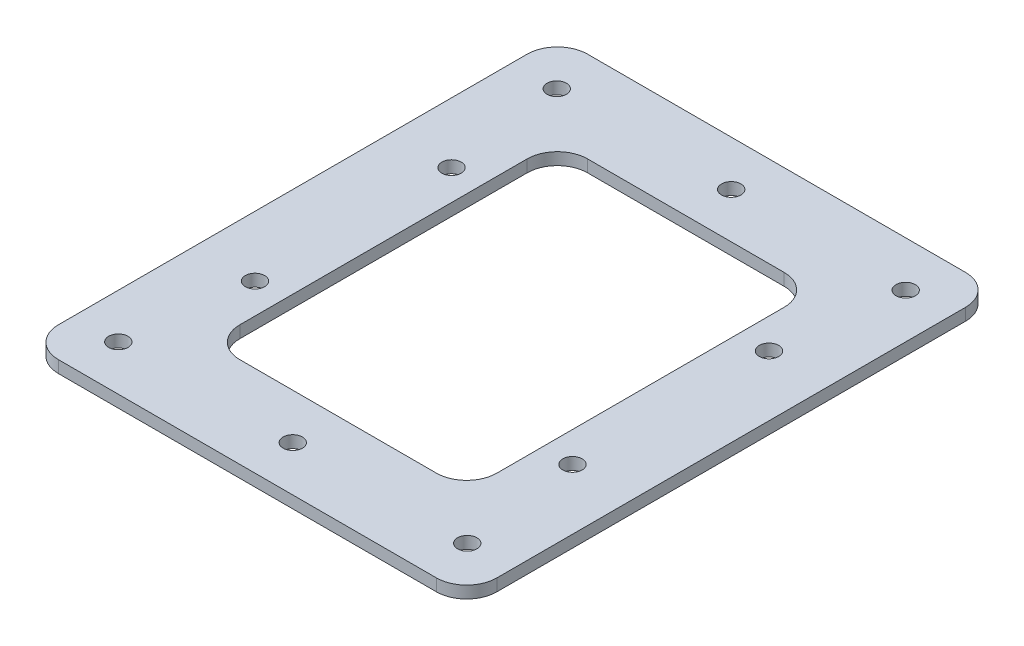
ISO-10303-21;
HEADER;
FILE_DESCRIPTION(('STEP AP214'),'2;1');
FILE_NAME('part.step','',(''),(''),'','','');
FILE_SCHEMA(('AUTOMOTIVE_DESIGN { 1 0 10303 214 1 1 1 1 }'));
ENDSEC;
DATA;
#1=APPLICATION_CONTEXT('core data for automotive mechanical design processes');
#2=APPLICATION_PROTOCOL_DEFINITION('international standard','automotive_design',2000,#1);
#3=PRODUCT_CONTEXT('',#1,'mechanical');
#4=PRODUCT('Part','Part','',(#3));
#5=PRODUCT_RELATED_PRODUCT_CATEGORY('part','',(#4));
#6=PRODUCT_DEFINITION_FORMATION('','',#4);
#7=PRODUCT_DEFINITION_CONTEXT('part definition',#1,'design');
#8=PRODUCT_DEFINITION('design','',#6,#7);
#9=PRODUCT_DEFINITION_SHAPE('','',#8);
#10=(LENGTH_UNIT() NAMED_UNIT(*) SI_UNIT(.MILLI.,.METRE.));
#11=(NAMED_UNIT(*) PLANE_ANGLE_UNIT() SI_UNIT($,.RADIAN.));
#12=(NAMED_UNIT(*) SI_UNIT($,.STERADIAN.) SOLID_ANGLE_UNIT());
#13=UNCERTAINTY_MEASURE_WITH_UNIT(LENGTH_MEASURE(1.E-05),#10,'distance_accuracy_value','');
#14=(GEOMETRIC_REPRESENTATION_CONTEXT(3) GLOBAL_UNCERTAINTY_ASSIGNED_CONTEXT((#13)) GLOBAL_UNIT_ASSIGNED_CONTEXT((#10,
#11,#12)) REPRESENTATION_CONTEXT('',''));
#15=CARTESIAN_POINT('',(0.,0.,0.));
#16=DIRECTION('',(0.,0.,1.));
#17=DIRECTION('',(1.,0.,0.));
#18=AXIS2_PLACEMENT_3D('',#15,#16,#17);
#19=CARTESIAN_POINT('',(0.,2.,0.));
#20=DIRECTION('',(0.,1.,0.));
#21=DIRECTION('',(0.,0.,1.));
#22=AXIS2_PLACEMENT_3D('',#19,#20,#21);
#23=PLANE('',#22);
#24=CARTESIAN_POINT('',(47.5,2.,-12.5));
#25=DIRECTION('',(0.,1.,0.));
#26=DIRECTION('',(0.,0.,-1.));
#27=AXIS2_PLACEMENT_3D('',#24,#25,#26);
#28=CIRCLE('',#27,1.6);
#29=CARTESIAN_POINT('',(47.5,2.,-14.1));
#30=VERTEX_POINT('',#29);
#31=EDGE_CURVE('E685',#30,#30,#28,.T.);
#32=ORIENTED_EDGE('',*,*,#31,.F.);
#33=EDGE_LOOP('',(#32));
#34=FACE_BOUND('',#33,.T.);
#35=CARTESIAN_POINT('',(-5.,2.,-12.5));
#36=DIRECTION('',(0.,1.,0.));
#37=DIRECTION('',(0.,0.,1.));
#38=AXIS2_PLACEMENT_3D('',#35,#36,#37);
#39=CIRCLE('',#38,1.6);
#40=CARTESIAN_POINT('',(-5.,2.,-10.9));
#41=VERTEX_POINT('',#40);
#42=EDGE_CURVE('E669',#41,#41,#39,.T.);
#43=ORIENTED_EDGE('',*,*,#42,.F.);
#44=EDGE_LOOP('',(#43));
#45=FACE_BOUND('',#44,.T.);
#46=CARTESIAN_POINT('',(21.25,2.,7.49999999999999));
#47=DIRECTION('',(0.,1.,0.));
#48=DIRECTION('',(0.,0.,1.));
#49=AXIS2_PLACEMENT_3D('',#46,#47,#48);
#50=CIRCLE('',#49,1.6);
#51=CARTESIAN_POINT('',(21.25,2.,9.1));
#52=VERTEX_POINT('',#51);
#53=EDGE_CURVE('E653',#52,#52,#50,.T.);
#54=ORIENTED_EDGE('',*,*,#53,.F.);
#55=EDGE_LOOP('',(#54));
#56=FACE_BOUND('',#55,.T.);
#57=CARTESIAN_POINT('',(50.1,2.,-65.));
#58=DIRECTION('',(0.,1.,0.));
#59=DIRECTION('',(0.,0.,1.));
#60=AXIS2_PLACEMENT_3D('',#57,#58,#59);
#61=CIRCLE('',#60,1.6);
#62=CARTESIAN_POINT('',(50.1,2.,-63.4));
#63=VERTEX_POINT('',#62);
#64=EDGE_CURVE('E637',#63,#63,#61,.T.);
#65=ORIENTED_EDGE('',*,*,#64,.F.);
#66=EDGE_LOOP('',(#65));
#67=FACE_BOUND('',#66,.T.);
#68=CARTESIAN_POINT('',(-7.6,2.,-65.));
#69=DIRECTION('',(0.,1.,0.));
#70=DIRECTION('',(0.,0.,1.));
#71=AXIS2_PLACEMENT_3D('',#68,#69,#70);
#72=CIRCLE('',#71,1.6);
#73=CARTESIAN_POINT('',(-7.6,2.,-63.4));
#74=VERTEX_POINT('',#73);
#75=EDGE_CURVE('E298',#74,#74,#72,.T.);
#76=ORIENTED_EDGE('',*,*,#75,.F.);
#77=EDGE_LOOP('',(#76));
#78=FACE_BOUND('',#77,.T.);
#79=DIRECTION('',(0.,0.,1.));
#80=VECTOR('',#79,1.);
#81=CARTESIAN_POINT('',(-15.,2.,15.));
#82=LINE('',#81,#80);
#83=CARTESIAN_POINT('',(-15.,2.,-67.5));
#84=VERTEX_POINT('',#83);
#85=CARTESIAN_POINT('',(-15.,2.,10.));
#86=VERTEX_POINT('',#85);
#87=EDGE_CURVE('E190',#84,#86,#82,.T.);
#88=ORIENTED_EDGE('',*,*,#87,.T.);
#89=CARTESIAN_POINT('',(-10.,2.,10.));
#90=DIRECTION('',(0.,1.,0.));
#91=DIRECTION('',(0.,0.,1.));
#92=AXIS2_PLACEMENT_3D('',#89,#90,#91);
#93=CIRCLE('',#92,5.);
#94=CARTESIAN_POINT('',(-10.,2.,15.));
#95=VERTEX_POINT('',#94);
#96=EDGE_CURVE('E256',#86,#95,#93,.T.);
#97=ORIENTED_EDGE('',*,*,#96,.T.);
#98=DIRECTION('',(1.,0.,0.));
#99=VECTOR('',#98,1.);
#100=CARTESIAN_POINT('',(-15.,2.,15.));
#101=LINE('',#100,#99);
#102=CARTESIAN_POINT('',(52.5,2.,15.));
#103=VERTEX_POINT('',#102);
#104=EDGE_CURVE('E330',#95,#103,#101,.T.);
#105=ORIENTED_EDGE('',*,*,#104,.T.);
#106=CARTESIAN_POINT('',(52.5,2.,10.));
#107=DIRECTION('',(0.,1.,0.));
#108=DIRECTION('',(0.,0.,1.));
#109=AXIS2_PLACEMENT_3D('',#106,#107,#108);
#110=CIRCLE('',#109,5.);
#111=CARTESIAN_POINT('',(57.5,2.,10.));
#112=VERTEX_POINT('',#111);
#113=EDGE_CURVE('E253',#103,#112,#110,.T.);
#114=ORIENTED_EDGE('',*,*,#113,.T.);
#115=DIRECTION('',(0.,0.,-1.));
#116=VECTOR('',#115,1.);
#117=CARTESIAN_POINT('',(57.5,2.,15.));
#118=LINE('',#117,#116);
#119=CARTESIAN_POINT('',(57.5,2.,-67.5));
#120=VERTEX_POINT('',#119);
#121=EDGE_CURVE('E334',#112,#120,#118,.T.);
#122=ORIENTED_EDGE('',*,*,#121,.T.);
#123=CARTESIAN_POINT('',(52.5,2.,-67.5));
#124=DIRECTION('',(0.,1.,0.));
#125=DIRECTION('',(0.,0.,1.));
#126=AXIS2_PLACEMENT_3D('',#123,#124,#125);
#127=CIRCLE('',#126,5.);
#128=CARTESIAN_POINT('',(52.5,2.,-72.5));
#129=VERTEX_POINT('',#128);
#130=EDGE_CURVE('E68',#120,#129,#127,.T.);
#131=ORIENTED_EDGE('',*,*,#130,.T.);
#132=DIRECTION('',(-1.,0.,0.));
#133=VECTOR('',#132,1.);
#134=CARTESIAN_POINT('',(-15.,2.,-72.5));
#135=LINE('',#134,#133);
#136=CARTESIAN_POINT('',(-10.,2.,-72.5));
#137=VERTEX_POINT('',#136);
#138=EDGE_CURVE('E197',#129,#137,#135,.T.);
#139=ORIENTED_EDGE('',*,*,#138,.T.);
#140=CARTESIAN_POINT('',(-10.,2.,-67.5));
#141=DIRECTION('',(0.,1.,0.));
#142=DIRECTION('',(0.,0.,1.));
#143=AXIS2_PLACEMENT_3D('',#140,#141,#142);
#144=CIRCLE('',#143,5.);
#145=EDGE_CURVE('E248',#137,#84,#144,.T.);
#146=ORIENTED_EDGE('',*,*,#145,.T.);
#147=EDGE_LOOP('',(#88,#97,#105,#114,#122,#131,#139,#146));
#148=FACE_BOUND('',#147,.T.);
#149=DIRECTION('',(1.,0.,0.));
#150=VECTOR('',#149,1.);
#151=CARTESIAN_POINT('',(0.,2.,0.));
#152=LINE('',#151,#150);
#153=CARTESIAN_POINT('',(5.,2.,0.));
#154=VERTEX_POINT('',#153);
#155=CARTESIAN_POINT('',(37.5,2.,0.));
#156=VERTEX_POINT('',#155);
#157=EDGE_CURVE('E322',#154,#156,#152,.T.);
#158=ORIENTED_EDGE('',*,*,#157,.F.);
#159=CARTESIAN_POINT('',(5.,2.,-5.));
#160=DIRECTION('',(0.,1.,0.));
#161=DIRECTION('',(0.,0.,1.));
#162=AXIS2_PLACEMENT_3D('',#159,#160,#161);
#163=CIRCLE('',#162,5.);
#164=CARTESIAN_POINT('',(0.,2.,-5.));
#165=VERTEX_POINT('',#164);
#166=EDGE_CURVE('E282',#154,#165,#163,.F.);
#167=ORIENTED_EDGE('',*,*,#166,.T.);
#168=DIRECTION('',(0.,0.,1.));
#169=VECTOR('',#168,1.);
#170=CARTESIAN_POINT('',(0.,2.,0.));
#171=LINE('',#170,#169);
#172=CARTESIAN_POINT('',(0.,2.,-52.5));
#173=VERTEX_POINT('',#172);
#174=EDGE_CURVE('E309',#173,#165,#171,.T.);
#175=ORIENTED_EDGE('',*,*,#174,.F.);
#176=CARTESIAN_POINT('',(4.99999999999999,2.,-52.5));
#177=DIRECTION('',(0.,1.,0.));
#178=DIRECTION('',(0.,0.,1.));
#179=AXIS2_PLACEMENT_3D('',#176,#177,#178);
#180=CIRCLE('',#179,5.);
#181=CARTESIAN_POINT('',(4.99999999999999,2.,-57.5));
#182=VERTEX_POINT('',#181);
#183=EDGE_CURVE('E11',#173,#182,#180,.F.);
#184=ORIENTED_EDGE('',*,*,#183,.T.);
#185=DIRECTION('',(-1.,0.,0.));
#186=VECTOR('',#185,1.);
#187=CARTESIAN_POINT('',(0.,2.,-57.5));
#188=LINE('',#187,#186);
#189=CARTESIAN_POINT('',(37.5,2.,-57.5));
#190=VERTEX_POINT('',#189);
#191=EDGE_CURVE('E307',#190,#182,#188,.T.);
#192=ORIENTED_EDGE('',*,*,#191,.F.);
#193=CARTESIAN_POINT('',(37.5,2.,-52.5));
#194=DIRECTION('',(0.,1.,0.));
#195=DIRECTION('',(0.,0.,1.));
#196=AXIS2_PLACEMENT_3D('',#193,#194,#195);
#197=CIRCLE('',#196,5.);
#198=CARTESIAN_POINT('',(42.5,2.,-52.5));
#199=VERTEX_POINT('',#198);
#200=EDGE_CURVE('E174',#190,#199,#197,.F.);
#201=ORIENTED_EDGE('',*,*,#200,.T.);
#202=DIRECTION('',(0.,0.,-1.));
#203=VECTOR('',#202,1.);
#204=CARTESIAN_POINT('',(42.5,2.,0.));
#205=LINE('',#204,#203);
#206=CARTESIAN_POINT('',(42.5,2.,-5.));
#207=VERTEX_POINT('',#206);
#208=EDGE_CURVE('E315',#207,#199,#205,.T.);
#209=ORIENTED_EDGE('',*,*,#208,.F.);
#210=CARTESIAN_POINT('',(37.5,2.,-5.));
#211=DIRECTION('',(0.,1.,0.));
#212=DIRECTION('',(0.,0.,1.));
#213=AXIS2_PLACEMENT_3D('',#210,#211,#212);
#214=CIRCLE('',#213,5.);
#215=EDGE_CURVE('E173',#207,#156,#214,.F.);
#216=ORIENTED_EDGE('',*,*,#215,.T.);
#217=EDGE_LOOP('',(#158,#167,#175,#184,#192,#201,#209,#216));
#218=FACE_BOUND('',#217,.T.);
#219=CARTESIAN_POINT('',(21.25,2.,-65.));
#220=DIRECTION('',(0.,1.,0.));
#221=DIRECTION('',(0.,0.,1.));
#222=AXIS2_PLACEMENT_3D('',#219,#220,#221);
#223=CIRCLE('',#222,1.6);
#224=CARTESIAN_POINT('',(21.25,2.,-63.4));
#225=VERTEX_POINT('',#224);
#226=EDGE_CURVE('E629',#225,#225,#223,.T.);
#227=ORIENTED_EDGE('',*,*,#226,.F.);
#228=EDGE_LOOP('',(#227));
#229=FACE_BOUND('',#228,.T.);
#230=CARTESIAN_POINT('',(50.1,2.,7.5));
#231=DIRECTION('',(0.,1.,0.));
#232=DIRECTION('',(0.,0.,1.));
#233=AXIS2_PLACEMENT_3D('',#230,#231,#232);
#234=CIRCLE('',#233,1.6);
#235=CARTESIAN_POINT('',(50.1,2.,9.1));
#236=VERTEX_POINT('',#235);
#237=EDGE_CURVE('E645',#236,#236,#234,.T.);
#238=ORIENTED_EDGE('',*,*,#237,.F.);
#239=EDGE_LOOP('',(#238));
#240=FACE_BOUND('',#239,.T.);
#241=CARTESIAN_POINT('',(-7.6,2.,7.5));
#242=DIRECTION('',(0.,1.,0.));
#243=DIRECTION('',(0.,0.,1.));
#244=AXIS2_PLACEMENT_3D('',#241,#242,#243);
#245=CIRCLE('',#244,1.6);
#246=CARTESIAN_POINT('',(-7.6,2.,9.1));
#247=VERTEX_POINT('',#246);
#248=EDGE_CURVE('E661',#247,#247,#245,.T.);
#249=ORIENTED_EDGE('',*,*,#248,.F.);
#250=EDGE_LOOP('',(#249));
#251=FACE_BOUND('',#250,.T.);
#252=CARTESIAN_POINT('',(-5.,2.,-45.));
#253=DIRECTION('',(0.,1.,0.));
#254=DIRECTION('',(0.,0.,1.));
#255=AXIS2_PLACEMENT_3D('',#252,#253,#254);
#256=CIRCLE('',#255,1.59999999999999);
#257=CARTESIAN_POINT('',(-5.,2.,-43.4));
#258=VERTEX_POINT('',#257);
#259=EDGE_CURVE('E677',#258,#258,#256,.T.);
#260=ORIENTED_EDGE('',*,*,#259,.F.);
#261=EDGE_LOOP('',(#260));
#262=FACE_BOUND('',#261,.T.);
#263=CARTESIAN_POINT('',(47.5,2.,-45.));
#264=DIRECTION('',(0.,1.,0.));
#265=DIRECTION('',(0.,0.,-1.));
#266=AXIS2_PLACEMENT_3D('',#263,#264,#265);
#267=CIRCLE('',#266,1.59999999999999);
#268=CARTESIAN_POINT('',(47.5,2.,-46.6));
#269=VERTEX_POINT('',#268);
#270=EDGE_CURVE('E693',#269,#269,#267,.T.);
#271=ORIENTED_EDGE('',*,*,#270,.F.);
#272=EDGE_LOOP('',(#271));
#273=FACE_BOUND('',#272,.T.);
#274=ADVANCED_FACE('F45',(#34,#45,#56,#67,#78,#148,#218,#229,#240,#251,#262,#273),#23,.T.);
#275=CARTESIAN_POINT('',(0.,0.,0.));
#276=DIRECTION('',(0.,1.,0.));
#277=DIRECTION('',(0.,0.,1.));
#278=AXIS2_PLACEMENT_3D('',#275,#276,#277);
#279=PLANE('',#278);
#280=DIRECTION('',(1.,0.,0.));
#281=VECTOR('',#280,1.);
#282=CARTESIAN_POINT('',(-15.,0.,15.));
#283=LINE('',#282,#281);
#284=CARTESIAN_POINT('',(-10.,0.,15.));
#285=VERTEX_POINT('',#284);
#286=CARTESIAN_POINT('',(52.5,0.,15.));
#287=VERTEX_POINT('',#286);
#288=EDGE_CURVE('E314',#285,#287,#283,.T.);
#289=ORIENTED_EDGE('',*,*,#288,.F.);
#290=CARTESIAN_POINT('',(-10.,0.,10.));
#291=DIRECTION('',(0.,1.,0.));
#292=DIRECTION('',(0.,0.,1.));
#293=AXIS2_PLACEMENT_3D('',#290,#291,#292);
#294=CIRCLE('',#293,5.);
#295=CARTESIAN_POINT('',(-15.,0.,10.));
#296=VERTEX_POINT('',#295);
#297=EDGE_CURVE('E238',#285,#296,#294,.F.);
#298=ORIENTED_EDGE('',*,*,#297,.T.);
#299=DIRECTION('',(0.,0.,1.));
#300=VECTOR('',#299,1.);
#301=CARTESIAN_POINT('',(-15.,0.,15.));
#302=LINE('',#301,#300);
#303=CARTESIAN_POINT('',(-15.,0.,-67.5));
#304=VERTEX_POINT('',#303);
#305=EDGE_CURVE('E200',#304,#296,#302,.T.);
#306=ORIENTED_EDGE('',*,*,#305,.F.);
#307=CARTESIAN_POINT('',(-10.,0.,-67.5));
#308=DIRECTION('',(0.,1.,0.));
#309=DIRECTION('',(0.,0.,1.));
#310=AXIS2_PLACEMENT_3D('',#307,#308,#309);
#311=CIRCLE('',#310,5.);
#312=CARTESIAN_POINT('',(-10.,0.,-72.5));
#313=VERTEX_POINT('',#312);
#314=EDGE_CURVE('E229',#304,#313,#311,.F.);
#315=ORIENTED_EDGE('',*,*,#314,.T.);
#316=DIRECTION('',(-1.,0.,0.));
#317=VECTOR('',#316,1.);
#318=CARTESIAN_POINT('',(-15.,0.,-72.5));
#319=LINE('',#318,#317);
#320=CARTESIAN_POINT('',(52.5,0.,-72.5));
#321=VERTEX_POINT('',#320);
#322=EDGE_CURVE('E341',#321,#313,#319,.T.);
#323=ORIENTED_EDGE('',*,*,#322,.F.);
#324=CARTESIAN_POINT('',(52.5,0.,-67.5));
#325=DIRECTION('',(0.,1.,0.));
#326=DIRECTION('',(0.,0.,1.));
#327=AXIS2_PLACEMENT_3D('',#324,#325,#326);
#328=CIRCLE('',#327,5.);
#329=CARTESIAN_POINT('',(57.5,0.,-67.5));
#330=VERTEX_POINT('',#329);
#331=EDGE_CURVE('E232',#321,#330,#328,.F.);
#332=ORIENTED_EDGE('',*,*,#331,.T.);
#333=DIRECTION('',(0.,0.,-1.));
#334=VECTOR('',#333,1.);
#335=CARTESIAN_POINT('',(57.5,0.,15.));
#336=LINE('',#335,#334);
#337=CARTESIAN_POINT('',(57.5,0.,10.));
#338=VERTEX_POINT('',#337);
#339=EDGE_CURVE('E320',#338,#330,#336,.T.);
#340=ORIENTED_EDGE('',*,*,#339,.F.);
#341=CARTESIAN_POINT('',(52.5,0.,10.));
#342=DIRECTION('',(0.,1.,0.));
#343=DIRECTION('',(0.,0.,1.));
#344=AXIS2_PLACEMENT_3D('',#341,#342,#343);
#345=CIRCLE('',#344,5.);
#346=EDGE_CURVE('E235',#338,#287,#345,.F.);
#347=ORIENTED_EDGE('',*,*,#346,.T.);
#348=EDGE_LOOP('',(#289,#298,#306,#315,#323,#332,#340,#347));
#349=FACE_BOUND('',#348,.T.);
#350=DIRECTION('',(-1.,0.,0.));
#351=VECTOR('',#350,1.);
#352=CARTESIAN_POINT('',(0.,0.,-57.5));
#353=LINE('',#352,#351);
#354=CARTESIAN_POINT('',(37.5,0.,-57.5));
#355=VERTEX_POINT('',#354);
#356=CARTESIAN_POINT('',(4.99999999999999,0.,-57.5));
#357=VERTEX_POINT('',#356);
#358=EDGE_CURVE('E185',#355,#357,#353,.T.);
#359=ORIENTED_EDGE('',*,*,#358,.T.);
#360=CARTESIAN_POINT('',(4.99999999999999,0.,-52.5));
#361=DIRECTION('',(0.,1.,0.));
#362=DIRECTION('',(0.,0.,1.));
#363=AXIS2_PLACEMENT_3D('',#360,#361,#362);
#364=CIRCLE('',#363,5.);
#365=CARTESIAN_POINT('',(0.,0.,-52.5));
#366=VERTEX_POINT('',#365);
#367=EDGE_CURVE('E54',#357,#366,#364,.T.);
#368=ORIENTED_EDGE('',*,*,#367,.T.);
#369=DIRECTION('',(0.,0.,1.));
#370=VECTOR('',#369,1.);
#371=CARTESIAN_POINT('',(0.,0.,0.));
#372=LINE('',#371,#370);
#373=CARTESIAN_POINT('',(0.,0.,-5.));
#374=VERTEX_POINT('',#373);
#375=EDGE_CURVE('E287',#366,#374,#372,.T.);
#376=ORIENTED_EDGE('',*,*,#375,.T.);
#377=CARTESIAN_POINT('',(5.,0.,-5.));
#378=DIRECTION('',(0.,1.,0.));
#379=DIRECTION('',(0.,0.,1.));
#380=AXIS2_PLACEMENT_3D('',#377,#378,#379);
#381=CIRCLE('',#380,5.);
#382=CARTESIAN_POINT('',(5.,0.,0.));
#383=VERTEX_POINT('',#382);
#384=EDGE_CURVE('E279',#374,#383,#381,.T.);
#385=ORIENTED_EDGE('',*,*,#384,.T.);
#386=DIRECTION('',(1.,0.,0.));
#387=VECTOR('',#386,1.);
#388=CARTESIAN_POINT('',(0.,0.,0.));
#389=LINE('',#388,#387);
#390=CARTESIAN_POINT('',(37.5,0.,0.));
#391=VERTEX_POINT('',#390);
#392=EDGE_CURVE('E167',#383,#391,#389,.T.);
#393=ORIENTED_EDGE('',*,*,#392,.T.);
#394=CARTESIAN_POINT('',(37.5,0.,-5.));
#395=DIRECTION('',(0.,1.,0.));
#396=DIRECTION('',(0.,0.,1.));
#397=AXIS2_PLACEMENT_3D('',#394,#395,#396);
#398=CIRCLE('',#397,5.);
#399=CARTESIAN_POINT('',(42.5,0.,-5.));
#400=VERTEX_POINT('',#399);
#401=EDGE_CURVE('E160',#391,#400,#398,.T.);
#402=ORIENTED_EDGE('',*,*,#401,.T.);
#403=DIRECTION('',(0.,0.,-1.));
#404=VECTOR('',#403,1.);
#405=CARTESIAN_POINT('',(42.5,0.,0.));
#406=LINE('',#405,#404);
#407=CARTESIAN_POINT('',(42.5,0.,-52.5));
#408=VERTEX_POINT('',#407);
#409=EDGE_CURVE('E165',#400,#408,#406,.T.);
#410=ORIENTED_EDGE('',*,*,#409,.T.);
#411=CARTESIAN_POINT('',(37.5,0.,-52.5));
#412=DIRECTION('',(0.,1.,0.));
#413=DIRECTION('',(0.,0.,1.));
#414=AXIS2_PLACEMENT_3D('',#411,#412,#413);
#415=CIRCLE('',#414,5.);
#416=EDGE_CURVE('E272',#408,#355,#415,.T.);
#417=ORIENTED_EDGE('',*,*,#416,.T.);
#418=EDGE_LOOP('',(#359,#368,#376,#385,#393,#402,#410,#417));
#419=FACE_BOUND('',#418,.T.);
#420=CARTESIAN_POINT('',(-7.6,0.,-65.));
#421=DIRECTION('',(0.,1.,0.));
#422=DIRECTION('',(0.,0.,1.));
#423=AXIS2_PLACEMENT_3D('',#420,#421,#422);
#424=CIRCLE('',#423,1.6);
#425=CARTESIAN_POINT('',(-7.6,0.,-63.4));
#426=VERTEX_POINT('',#425);
#427=EDGE_CURVE('E625',#426,#426,#424,.T.);
#428=ORIENTED_EDGE('',*,*,#427,.T.);
#429=EDGE_LOOP('',(#428));
#430=FACE_BOUND('',#429,.T.);
#431=CARTESIAN_POINT('',(21.25,0.,-65.));
#432=DIRECTION('',(0.,1.,0.));
#433=DIRECTION('',(0.,0.,1.));
#434=AXIS2_PLACEMENT_3D('',#431,#432,#433);
#435=CIRCLE('',#434,1.6);
#436=CARTESIAN_POINT('',(21.25,0.,-63.4));
#437=VERTEX_POINT('',#436);
#438=EDGE_CURVE('E633',#437,#437,#435,.T.);
#439=ORIENTED_EDGE('',*,*,#438,.T.);
#440=EDGE_LOOP('',(#439));
#441=FACE_BOUND('',#440,.T.);
#442=CARTESIAN_POINT('',(50.1,0.,-65.));
#443=DIRECTION('',(0.,1.,0.));
#444=DIRECTION('',(0.,0.,1.));
#445=AXIS2_PLACEMENT_3D('',#442,#443,#444);
#446=CIRCLE('',#445,1.6);
#447=CARTESIAN_POINT('',(50.1,0.,-63.4));
#448=VERTEX_POINT('',#447);
#449=EDGE_CURVE('E641',#448,#448,#446,.T.);
#450=ORIENTED_EDGE('',*,*,#449,.T.);
#451=EDGE_LOOP('',(#450));
#452=FACE_BOUND('',#451,.T.);
#453=CARTESIAN_POINT('',(50.1,0.,7.5));
#454=DIRECTION('',(0.,1.,0.));
#455=DIRECTION('',(0.,0.,1.));
#456=AXIS2_PLACEMENT_3D('',#453,#454,#455);
#457=CIRCLE('',#456,1.6);
#458=CARTESIAN_POINT('',(50.1,0.,9.1));
#459=VERTEX_POINT('',#458);
#460=EDGE_CURVE('E649',#459,#459,#457,.T.);
#461=ORIENTED_EDGE('',*,*,#460,.T.);
#462=EDGE_LOOP('',(#461));
#463=FACE_BOUND('',#462,.T.);
#464=CARTESIAN_POINT('',(21.25,0.,7.49999999999999));
#465=DIRECTION('',(0.,1.,0.));
#466=DIRECTION('',(0.,0.,1.));
#467=AXIS2_PLACEMENT_3D('',#464,#465,#466);
#468=CIRCLE('',#467,1.6);
#469=CARTESIAN_POINT('',(21.25,0.,9.1));
#470=VERTEX_POINT('',#469);
#471=EDGE_CURVE('E657',#470,#470,#468,.T.);
#472=ORIENTED_EDGE('',*,*,#471,.T.);
#473=EDGE_LOOP('',(#472));
#474=FACE_BOUND('',#473,.T.);
#475=CARTESIAN_POINT('',(-7.6,0.,7.5));
#476=DIRECTION('',(0.,1.,0.));
#477=DIRECTION('',(0.,0.,1.));
#478=AXIS2_PLACEMENT_3D('',#475,#476,#477);
#479=CIRCLE('',#478,1.6);
#480=CARTESIAN_POINT('',(-7.6,0.,9.1));
#481=VERTEX_POINT('',#480);
#482=EDGE_CURVE('E665',#481,#481,#479,.T.);
#483=ORIENTED_EDGE('',*,*,#482,.T.);
#484=EDGE_LOOP('',(#483));
#485=FACE_BOUND('',#484,.T.);
#486=CARTESIAN_POINT('',(-5.,0.,-12.5));
#487=DIRECTION('',(0.,1.,0.));
#488=DIRECTION('',(0.,0.,1.));
#489=AXIS2_PLACEMENT_3D('',#486,#487,#488);
#490=CIRCLE('',#489,1.6);
#491=CARTESIAN_POINT('',(-5.,0.,-10.9));
#492=VERTEX_POINT('',#491);
#493=EDGE_CURVE('E673',#492,#492,#490,.T.);
#494=ORIENTED_EDGE('',*,*,#493,.T.);
#495=EDGE_LOOP('',(#494));
#496=FACE_BOUND('',#495,.T.);
#497=CARTESIAN_POINT('',(-5.,0.,-45.));
#498=DIRECTION('',(0.,1.,0.));
#499=DIRECTION('',(0.,0.,1.));
#500=AXIS2_PLACEMENT_3D('',#497,#498,#499);
#501=CIRCLE('',#500,1.59999999999999);
#502=CARTESIAN_POINT('',(-5.,0.,-43.4));
#503=VERTEX_POINT('',#502);
#504=EDGE_CURVE('E681',#503,#503,#501,.T.);
#505=ORIENTED_EDGE('',*,*,#504,.T.);
#506=EDGE_LOOP('',(#505));
#507=FACE_BOUND('',#506,.T.);
#508=CARTESIAN_POINT('',(47.5,0.,-12.5));
#509=DIRECTION('',(0.,1.,0.));
#510=DIRECTION('',(0.,0.,-1.));
#511=AXIS2_PLACEMENT_3D('',#508,#509,#510);
#512=CIRCLE('',#511,1.6);
#513=CARTESIAN_POINT('',(47.5,0.,-14.1));
#514=VERTEX_POINT('',#513);
#515=EDGE_CURVE('E689',#514,#514,#512,.T.);
#516=ORIENTED_EDGE('',*,*,#515,.T.);
#517=EDGE_LOOP('',(#516));
#518=FACE_BOUND('',#517,.T.);
#519=CARTESIAN_POINT('',(47.5,0.,-45.));
#520=DIRECTION('',(0.,1.,0.));
#521=DIRECTION('',(0.,0.,-1.));
#522=AXIS2_PLACEMENT_3D('',#519,#520,#521);
#523=CIRCLE('',#522,1.59999999999999);
#524=CARTESIAN_POINT('',(47.5,0.,-46.6));
#525=VERTEX_POINT('',#524);
#526=EDGE_CURVE('E697',#525,#525,#523,.T.);
#527=ORIENTED_EDGE('',*,*,#526,.T.);
#528=EDGE_LOOP('',(#527));
#529=FACE_BOUND('',#528,.T.);
#530=ADVANCED_FACE('F163',(#349,#419,#430,#441,#452,#463,#474,#485,#496,#507,#518,#529),#279,.F.);
#531=CARTESIAN_POINT('',(-15.,2.,15.));
#532=DIRECTION('',(0.,0.,-1.));
#533=DIRECTION('',(-1.,0.,0.));
#534=AXIS2_PLACEMENT_3D('',#531,#532,#533);
#535=PLANE('',#534);
#536=ORIENTED_EDGE('',*,*,#104,.F.);
#537=DIRECTION('',(0.,-1.,0.));
#538=VECTOR('',#537,1.);
#539=CARTESIAN_POINT('',(-10.,2.,15.));
#540=LINE('',#539,#538);
#541=EDGE_CURVE('E225',#95,#285,#540,.T.);
#542=ORIENTED_EDGE('',*,*,#541,.T.);
#543=ORIENTED_EDGE('',*,*,#288,.T.);
#544=DIRECTION('',(0.,-1.,0.));
#545=VECTOR('',#544,1.);
#546=CARTESIAN_POINT('',(52.5,2.,15.));
#547=LINE('',#546,#545);
#548=EDGE_CURVE('E222',#287,#103,#547,.F.);
#549=ORIENTED_EDGE('',*,*,#548,.T.);
#550=EDGE_LOOP('',(#536,#542,#543,#549));
#551=FACE_BOUND('',#550,.T.);
#552=ADVANCED_FACE('F360',(#551),#535,.F.);
#553=CARTESIAN_POINT('',(57.5,2.,15.));
#554=DIRECTION('',(-1.,0.,0.));
#555=DIRECTION('',(0.,0.,1.));
#556=AXIS2_PLACEMENT_3D('',#553,#554,#555);
#557=PLANE('',#556);
#558=ORIENTED_EDGE('',*,*,#121,.F.);
#559=DIRECTION('',(0.,-1.,0.));
#560=VECTOR('',#559,1.);
#561=CARTESIAN_POINT('',(57.5,2.,10.));
#562=LINE('',#561,#560);
#563=EDGE_CURVE('E262',#112,#338,#562,.T.);
#564=ORIENTED_EDGE('',*,*,#563,.T.);
#565=ORIENTED_EDGE('',*,*,#339,.T.);
#566=DIRECTION('',(0.,-1.,0.));
#567=VECTOR('',#566,1.);
#568=CARTESIAN_POINT('',(57.5,2.,-67.5));
#569=LINE('',#568,#567);
#570=EDGE_CURVE('E259',#330,#120,#569,.F.);
#571=ORIENTED_EDGE('',*,*,#570,.T.);
#572=EDGE_LOOP('',(#558,#564,#565,#571));
#573=FACE_BOUND('',#572,.T.);
#574=ADVANCED_FACE('F368',(#573),#557,.F.);
#575=CARTESIAN_POINT('',(-15.,2.,-72.5));
#576=DIRECTION('',(0.,0.,1.));
#577=DIRECTION('',(1.,0.,0.));
#578=AXIS2_PLACEMENT_3D('',#575,#576,#577);
#579=PLANE('',#578);
#580=ORIENTED_EDGE('',*,*,#138,.F.);
#581=DIRECTION('',(0.,-1.,0.));
#582=VECTOR('',#581,1.);
#583=CARTESIAN_POINT('',(52.5,2.,-72.5));
#584=LINE('',#583,#582);
#585=EDGE_CURVE('E268',#129,#321,#584,.T.);
#586=ORIENTED_EDGE('',*,*,#585,.T.);
#587=ORIENTED_EDGE('',*,*,#322,.T.);
#588=DIRECTION('',(0.,-1.,0.));
#589=VECTOR('',#588,1.);
#590=CARTESIAN_POINT('',(-10.,2.,-72.5));
#591=LINE('',#590,#589);
#592=EDGE_CURVE('E61',#313,#137,#591,.F.);
#593=ORIENTED_EDGE('',*,*,#592,.T.);
#594=EDGE_LOOP('',(#580,#586,#587,#593));
#595=FACE_BOUND('',#594,.T.);
#596=ADVANCED_FACE('F374',(#595),#579,.F.);
#597=CARTESIAN_POINT('',(-15.,2.,15.));
#598=DIRECTION('',(1.,0.,0.));
#599=DIRECTION('',(0.,0.,-1.));
#600=AXIS2_PLACEMENT_3D('',#597,#598,#599);
#601=PLANE('',#600);
#602=ORIENTED_EDGE('',*,*,#305,.T.);
#603=DIRECTION('',(0.,-1.,0.));
#604=VECTOR('',#603,1.);
#605=CARTESIAN_POINT('',(-15.,2.,10.));
#606=LINE('',#605,#604);
#607=EDGE_CURVE('E245',#296,#86,#606,.F.);
#608=ORIENTED_EDGE('',*,*,#607,.T.);
#609=ORIENTED_EDGE('',*,*,#87,.F.);
#610=DIRECTION('',(0.,-1.,0.));
#611=VECTOR('',#610,1.);
#612=CARTESIAN_POINT('',(-15.,2.,-67.5));
#613=LINE('',#612,#611);
#614=EDGE_CURVE('E241',#84,#304,#613,.T.);
#615=ORIENTED_EDGE('',*,*,#614,.T.);
#616=EDGE_LOOP('',(#602,#608,#609,#615));
#617=FACE_BOUND('',#616,.T.);
#618=ADVANCED_FACE('F349',(#617),#601,.F.);
#619=CARTESIAN_POINT('',(0.,2.,0.));
#620=DIRECTION('',(1.,0.,0.));
#621=DIRECTION('',(0.,0.,-1.));
#622=AXIS2_PLACEMENT_3D('',#619,#620,#621);
#623=PLANE('',#622);
#624=ORIENTED_EDGE('',*,*,#174,.T.);
#625=DIRECTION('',(0.,-1.,0.));
#626=VECTOR('',#625,1.);
#627=CARTESIAN_POINT('',(0.,0.,-5.));
#628=LINE('',#627,#626);
#629=EDGE_CURVE('E218',#165,#374,#628,.T.);
#630=ORIENTED_EDGE('',*,*,#629,.T.);
#631=ORIENTED_EDGE('',*,*,#375,.F.);
#632=DIRECTION('',(0.,-1.,0.));
#633=VECTOR('',#632,1.);
#634=CARTESIAN_POINT('',(0.,2.,-52.5));
#635=LINE('',#634,#633);
#636=EDGE_CURVE('E215',#366,#173,#635,.F.);
#637=ORIENTED_EDGE('',*,*,#636,.T.);
#638=EDGE_LOOP('',(#624,#630,#631,#637));
#639=FACE_BOUND('',#638,.T.);
#640=ADVANCED_FACE('F294',(#639),#623,.T.);
#641=CARTESIAN_POINT('',(0.,2.,0.));
#642=DIRECTION('',(0.,0.,-1.));
#643=DIRECTION('',(-1.,0.,0.));
#644=AXIS2_PLACEMENT_3D('',#641,#642,#643);
#645=PLANE('',#644);
#646=ORIENTED_EDGE('',*,*,#157,.T.);
#647=DIRECTION('',(0.,-1.,0.));
#648=VECTOR('',#647,1.);
#649=CARTESIAN_POINT('',(37.5,0.,0.));
#650=LINE('',#649,#648);
#651=EDGE_CURVE('E212',#156,#391,#650,.T.);
#652=ORIENTED_EDGE('',*,*,#651,.T.);
#653=ORIENTED_EDGE('',*,*,#392,.F.);
#654=DIRECTION('',(0.,-1.,0.));
#655=VECTOR('',#654,1.);
#656=CARTESIAN_POINT('',(5.,2.,0.));
#657=LINE('',#656,#655);
#658=EDGE_CURVE('E209',#383,#154,#657,.F.);
#659=ORIENTED_EDGE('',*,*,#658,.T.);
#660=EDGE_LOOP('',(#646,#652,#653,#659));
#661=FACE_BOUND('',#660,.T.);
#662=ADVANCED_FACE('F560',(#661),#645,.T.);
#663=CARTESIAN_POINT('',(42.5,2.,0.));
#664=DIRECTION('',(-1.,0.,0.));
#665=DIRECTION('',(0.,0.,1.));
#666=AXIS2_PLACEMENT_3D('',#663,#664,#665);
#667=PLANE('',#666);
#668=ORIENTED_EDGE('',*,*,#208,.T.);
#669=DIRECTION('',(0.,-1.,0.));
#670=VECTOR('',#669,1.);
#671=CARTESIAN_POINT('',(42.5,0.,-52.5));
#672=LINE('',#671,#670);
#673=EDGE_CURVE('E183',#199,#408,#672,.T.);
#674=ORIENTED_EDGE('',*,*,#673,.T.);
#675=ORIENTED_EDGE('',*,*,#409,.F.);
#676=DIRECTION('',(0.,-1.,0.));
#677=VECTOR('',#676,1.);
#678=CARTESIAN_POINT('',(42.5,2.,-5.));
#679=LINE('',#678,#677);
#680=EDGE_CURVE('E180',#400,#207,#679,.F.);
#681=ORIENTED_EDGE('',*,*,#680,.T.);
#682=EDGE_LOOP('',(#668,#674,#675,#681));
#683=FACE_BOUND('',#682,.T.);
#684=ADVANCED_FACE('F179',(#683),#667,.T.);
#685=CARTESIAN_POINT('',(0.,2.,-57.5));
#686=DIRECTION('',(0.,0.,1.));
#687=DIRECTION('',(1.,0.,0.));
#688=AXIS2_PLACEMENT_3D('',#685,#686,#687);
#689=PLANE('',#688);
#690=ORIENTED_EDGE('',*,*,#358,.F.);
#691=DIRECTION('',(0.,-1.,0.));
#692=VECTOR('',#691,1.);
#693=CARTESIAN_POINT('',(37.5,2.,-57.5));
#694=LINE('',#693,#692);
#695=EDGE_CURVE('E206',#355,#190,#694,.F.);
#696=ORIENTED_EDGE('',*,*,#695,.T.);
#697=ORIENTED_EDGE('',*,*,#191,.T.);
#698=DIRECTION('',(0.,-1.,0.));
#699=VECTOR('',#698,1.);
#700=CARTESIAN_POINT('',(4.99999999999999,0.,-57.5));
#701=LINE('',#700,#699);
#702=EDGE_CURVE('E194',#182,#357,#701,.T.);
#703=ORIENTED_EDGE('',*,*,#702,.T.);
#704=EDGE_LOOP('',(#690,#696,#697,#703));
#705=FACE_BOUND('',#704,.T.);
#706=ADVANCED_FACE('F311',(#705),#689,.T.);
#707=CARTESIAN_POINT('',(-7.6,2.,-65.));
#708=DIRECTION('',(0.,-1.,0.));
#709=DIRECTION('',(0.,0.,-1.));
#710=AXIS2_PLACEMENT_3D('',#707,#708,#709);
#711=CYLINDRICAL_SURFACE('',#710,1.6);
#712=ORIENTED_EDGE('',*,*,#75,.T.);
#713=EDGE_LOOP('',(#712));
#714=FACE_BOUND('',#713,.T.);
#715=ORIENTED_EDGE('',*,*,#427,.F.);
#716=EDGE_LOOP('',(#715));
#717=FACE_BOUND('',#716,.T.);
#718=ADVANCED_FACE('F536',(#714,#717),#711,.F.);
#719=CARTESIAN_POINT('',(21.25,2.,-65.));
#720=DIRECTION('',(0.,-1.,0.));
#721=DIRECTION('',(0.,0.,-1.));
#722=AXIS2_PLACEMENT_3D('',#719,#720,#721);
#723=CYLINDRICAL_SURFACE('',#722,1.6);
#724=ORIENTED_EDGE('',*,*,#226,.T.);
#725=EDGE_LOOP('',(#724));
#726=FACE_BOUND('',#725,.T.);
#727=ORIENTED_EDGE('',*,*,#438,.F.);
#728=EDGE_LOOP('',(#727));
#729=FACE_BOUND('',#728,.T.);
#730=ADVANCED_FACE('F527',(#726,#729),#723,.F.);
#731=CARTESIAN_POINT('',(50.1,2.,-65.));
#732=DIRECTION('',(0.,-1.,0.));
#733=DIRECTION('',(0.,0.,-1.));
#734=AXIS2_PLACEMENT_3D('',#731,#732,#733);
#735=CYLINDRICAL_SURFACE('',#734,1.6);
#736=ORIENTED_EDGE('',*,*,#64,.T.);
#737=EDGE_LOOP('',(#736));
#738=FACE_BOUND('',#737,.T.);
#739=ORIENTED_EDGE('',*,*,#449,.F.);
#740=EDGE_LOOP('',(#739));
#741=FACE_BOUND('',#740,.T.);
#742=ADVANCED_FACE('F518',(#738,#741),#735,.F.);
#743=CARTESIAN_POINT('',(50.1,2.,7.5));
#744=DIRECTION('',(0.,-1.,0.));
#745=DIRECTION('',(0.,0.,-1.));
#746=AXIS2_PLACEMENT_3D('',#743,#744,#745);
#747=CYLINDRICAL_SURFACE('',#746,1.6);
#748=ORIENTED_EDGE('',*,*,#237,.T.);
#749=EDGE_LOOP('',(#748));
#750=FACE_BOUND('',#749,.T.);
#751=ORIENTED_EDGE('',*,*,#460,.F.);
#752=EDGE_LOOP('',(#751));
#753=FACE_BOUND('',#752,.T.);
#754=ADVANCED_FACE('F509',(#750,#753),#747,.F.);
#755=CARTESIAN_POINT('',(21.25,2.,7.49999999999999));
#756=DIRECTION('',(0.,-1.,0.));
#757=DIRECTION('',(0.,0.,-1.));
#758=AXIS2_PLACEMENT_3D('',#755,#756,#757);
#759=CYLINDRICAL_SURFACE('',#758,1.6);
#760=ORIENTED_EDGE('',*,*,#53,.T.);
#761=EDGE_LOOP('',(#760));
#762=FACE_BOUND('',#761,.T.);
#763=ORIENTED_EDGE('',*,*,#471,.F.);
#764=EDGE_LOOP('',(#763));
#765=FACE_BOUND('',#764,.T.);
#766=ADVANCED_FACE('F500',(#762,#765),#759,.F.);
#767=CARTESIAN_POINT('',(-7.6,2.,7.5));
#768=DIRECTION('',(0.,-1.,0.));
#769=DIRECTION('',(0.,0.,-1.));
#770=AXIS2_PLACEMENT_3D('',#767,#768,#769);
#771=CYLINDRICAL_SURFACE('',#770,1.6);
#772=ORIENTED_EDGE('',*,*,#248,.T.);
#773=EDGE_LOOP('',(#772));
#774=FACE_BOUND('',#773,.T.);
#775=ORIENTED_EDGE('',*,*,#482,.F.);
#776=EDGE_LOOP('',(#775));
#777=FACE_BOUND('',#776,.T.);
#778=ADVANCED_FACE('F491',(#774,#777),#771,.F.);
#779=CARTESIAN_POINT('',(-5.,2.,-12.5));
#780=DIRECTION('',(0.,-1.,0.));
#781=DIRECTION('',(0.,0.,-1.));
#782=AXIS2_PLACEMENT_3D('',#779,#780,#781);
#783=CYLINDRICAL_SURFACE('',#782,1.6);
#784=ORIENTED_EDGE('',*,*,#42,.T.);
#785=EDGE_LOOP('',(#784));
#786=FACE_BOUND('',#785,.T.);
#787=ORIENTED_EDGE('',*,*,#493,.F.);
#788=EDGE_LOOP('',(#787));
#789=FACE_BOUND('',#788,.T.);
#790=ADVANCED_FACE('F482',(#786,#789),#783,.F.);
#791=CARTESIAN_POINT('',(-5.,2.,-45.));
#792=DIRECTION('',(0.,-1.,0.));
#793=DIRECTION('',(0.,0.,-1.));
#794=AXIS2_PLACEMENT_3D('',#791,#792,#793);
#795=CYLINDRICAL_SURFACE('',#794,1.59999999999999);
#796=ORIENTED_EDGE('',*,*,#259,.T.);
#797=EDGE_LOOP('',(#796));
#798=FACE_BOUND('',#797,.T.);
#799=ORIENTED_EDGE('',*,*,#504,.F.);
#800=EDGE_LOOP('',(#799));
#801=FACE_BOUND('',#800,.T.);
#802=ADVANCED_FACE('F473',(#798,#801),#795,.F.);
#803=CARTESIAN_POINT('',(47.5,2.,-12.5));
#804=DIRECTION('',(0.,-1.,0.));
#805=DIRECTION('',(0.,0.,-1.));
#806=AXIS2_PLACEMENT_3D('',#803,#804,#805);
#807=CYLINDRICAL_SURFACE('',#806,1.6);
#808=ORIENTED_EDGE('',*,*,#31,.T.);
#809=EDGE_LOOP('',(#808));
#810=FACE_BOUND('',#809,.T.);
#811=ORIENTED_EDGE('',*,*,#515,.F.);
#812=EDGE_LOOP('',(#811));
#813=FACE_BOUND('',#812,.T.);
#814=ADVANCED_FACE('F464',(#810,#813),#807,.F.);
#815=CARTESIAN_POINT('',(47.5,2.,-45.));
#816=DIRECTION('',(0.,-1.,0.));
#817=DIRECTION('',(0.,0.,-1.));
#818=AXIS2_PLACEMENT_3D('',#815,#816,#817);
#819=CYLINDRICAL_SURFACE('',#818,1.59999999999999);
#820=ORIENTED_EDGE('',*,*,#270,.T.);
#821=EDGE_LOOP('',(#820));
#822=FACE_BOUND('',#821,.T.);
#823=ORIENTED_EDGE('',*,*,#526,.F.);
#824=EDGE_LOOP('',(#823));
#825=FACE_BOUND('',#824,.T.);
#826=ADVANCED_FACE('F405',(#822,#825),#819,.F.);
#827=CARTESIAN_POINT('',(37.5,2.,-52.5));
#828=DIRECTION('',(0.,1.,0.));
#829=DIRECTION('',(0.,0.,1.));
#830=AXIS2_PLACEMENT_3D('',#827,#828,#829);
#831=CYLINDRICAL_SURFACE('',#830,5.);
#832=ORIENTED_EDGE('',*,*,#200,.F.);
#833=ORIENTED_EDGE('',*,*,#695,.F.);
#834=ORIENTED_EDGE('',*,*,#416,.F.);
#835=ORIENTED_EDGE('',*,*,#673,.F.);
#836=EDGE_LOOP('',(#832,#833,#834,#835));
#837=FACE_BOUND('',#836,.T.);
#838=ADVANCED_FACE('F402',(#837),#831,.F.);
#839=CARTESIAN_POINT('',(37.5,2.,-5.));
#840=DIRECTION('',(0.,1.,0.));
#841=DIRECTION('',(0.,0.,1.));
#842=AXIS2_PLACEMENT_3D('',#839,#840,#841);
#843=CYLINDRICAL_SURFACE('',#842,5.);
#844=ORIENTED_EDGE('',*,*,#215,.F.);
#845=ORIENTED_EDGE('',*,*,#680,.F.);
#846=ORIENTED_EDGE('',*,*,#401,.F.);
#847=ORIENTED_EDGE('',*,*,#651,.F.);
#848=EDGE_LOOP('',(#844,#845,#846,#847));
#849=FACE_BOUND('',#848,.T.);
#850=ADVANCED_FACE('F188',(#849),#843,.F.);
#851=CARTESIAN_POINT('',(5.,2.,-5.));
#852=DIRECTION('',(0.,1.,0.));
#853=DIRECTION('',(0.,0.,1.));
#854=AXIS2_PLACEMENT_3D('',#851,#852,#853);
#855=CYLINDRICAL_SURFACE('',#854,5.);
#856=ORIENTED_EDGE('',*,*,#166,.F.);
#857=ORIENTED_EDGE('',*,*,#658,.F.);
#858=ORIENTED_EDGE('',*,*,#384,.F.);
#859=ORIENTED_EDGE('',*,*,#629,.F.);
#860=EDGE_LOOP('',(#856,#857,#858,#859));
#861=FACE_BOUND('',#860,.T.);
#862=ADVANCED_FACE('F409',(#861),#855,.F.);
#863=CARTESIAN_POINT('',(4.99999999999999,2.,-52.5));
#864=DIRECTION('',(0.,1.,0.));
#865=DIRECTION('',(0.,0.,1.));
#866=AXIS2_PLACEMENT_3D('',#863,#864,#865);
#867=CYLINDRICAL_SURFACE('',#866,5.);
#868=ORIENTED_EDGE('',*,*,#183,.F.);
#869=ORIENTED_EDGE('',*,*,#636,.F.);
#870=ORIENTED_EDGE('',*,*,#367,.F.);
#871=ORIENTED_EDGE('',*,*,#702,.F.);
#872=EDGE_LOOP('',(#868,#869,#870,#871));
#873=FACE_BOUND('',#872,.T.);
#874=ADVANCED_FACE('F301',(#873),#867,.F.);
#875=CARTESIAN_POINT('',(-10.,2.,10.));
#876=DIRECTION('',(0.,-1.,0.));
#877=DIRECTION('',(0.,0.,-1.));
#878=AXIS2_PLACEMENT_3D('',#875,#876,#877);
#879=CYLINDRICAL_SURFACE('',#878,5.);
#880=ORIENTED_EDGE('',*,*,#96,.F.);
#881=ORIENTED_EDGE('',*,*,#607,.F.);
#882=ORIENTED_EDGE('',*,*,#297,.F.);
#883=ORIENTED_EDGE('',*,*,#541,.F.);
#884=EDGE_LOOP('',(#880,#881,#882,#883));
#885=FACE_BOUND('',#884,.T.);
#886=ADVANCED_FACE('F355',(#885),#879,.T.);
#887=CARTESIAN_POINT('',(52.5,2.,10.));
#888=DIRECTION('',(0.,-1.,0.));
#889=DIRECTION('',(0.,0.,-1.));
#890=AXIS2_PLACEMENT_3D('',#887,#888,#889);
#891=CYLINDRICAL_SURFACE('',#890,5.);
#892=ORIENTED_EDGE('',*,*,#113,.F.);
#893=ORIENTED_EDGE('',*,*,#548,.F.);
#894=ORIENTED_EDGE('',*,*,#346,.F.);
#895=ORIENTED_EDGE('',*,*,#563,.F.);
#896=EDGE_LOOP('',(#892,#893,#894,#895));
#897=FACE_BOUND('',#896,.T.);
#898=ADVANCED_FACE('F364',(#897),#891,.T.);
#899=CARTESIAN_POINT('',(52.5,2.,-67.5));
#900=DIRECTION('',(0.,-1.,0.));
#901=DIRECTION('',(0.,0.,-1.));
#902=AXIS2_PLACEMENT_3D('',#899,#900,#901);
#903=CYLINDRICAL_SURFACE('',#902,5.);
#904=ORIENTED_EDGE('',*,*,#130,.F.);
#905=ORIENTED_EDGE('',*,*,#570,.F.);
#906=ORIENTED_EDGE('',*,*,#331,.F.);
#907=ORIENTED_EDGE('',*,*,#585,.F.);
#908=EDGE_LOOP('',(#904,#905,#906,#907));
#909=FACE_BOUND('',#908,.T.);
#910=ADVANCED_FACE('F372',(#909),#903,.T.);
#911=CARTESIAN_POINT('',(-10.,2.,-67.5));
#912=DIRECTION('',(0.,-1.,0.));
#913=DIRECTION('',(0.,0.,-1.));
#914=AXIS2_PLACEMENT_3D('',#911,#912,#913);
#915=CYLINDRICAL_SURFACE('',#914,5.);
#916=ORIENTED_EDGE('',*,*,#145,.F.);
#917=ORIENTED_EDGE('',*,*,#592,.F.);
#918=ORIENTED_EDGE('',*,*,#314,.F.);
#919=ORIENTED_EDGE('',*,*,#614,.F.);
#920=EDGE_LOOP('',(#916,#917,#918,#919));
#921=FACE_BOUND('',#920,.T.);
#922=ADVANCED_FACE('F47',(#921),#915,.T.);
#923=CLOSED_SHELL('',(#274,#530,#552,#574,#596,#618,#640,#662,#684,#706,#718,#730,#742,#754,
#766,#778,#790,#802,#814,#826,#838,#850,#862,#874,#886,#898,#910,#922));
#924=MANIFOLD_SOLID_BREP('B2',#923);
#925=ADVANCED_BREP_SHAPE_REPRESENTATION('',(#18,#924),#14);
#926=SHAPE_DEFINITION_REPRESENTATION(#9,#925);
ENDSEC;
END-ISO-10303-21;
